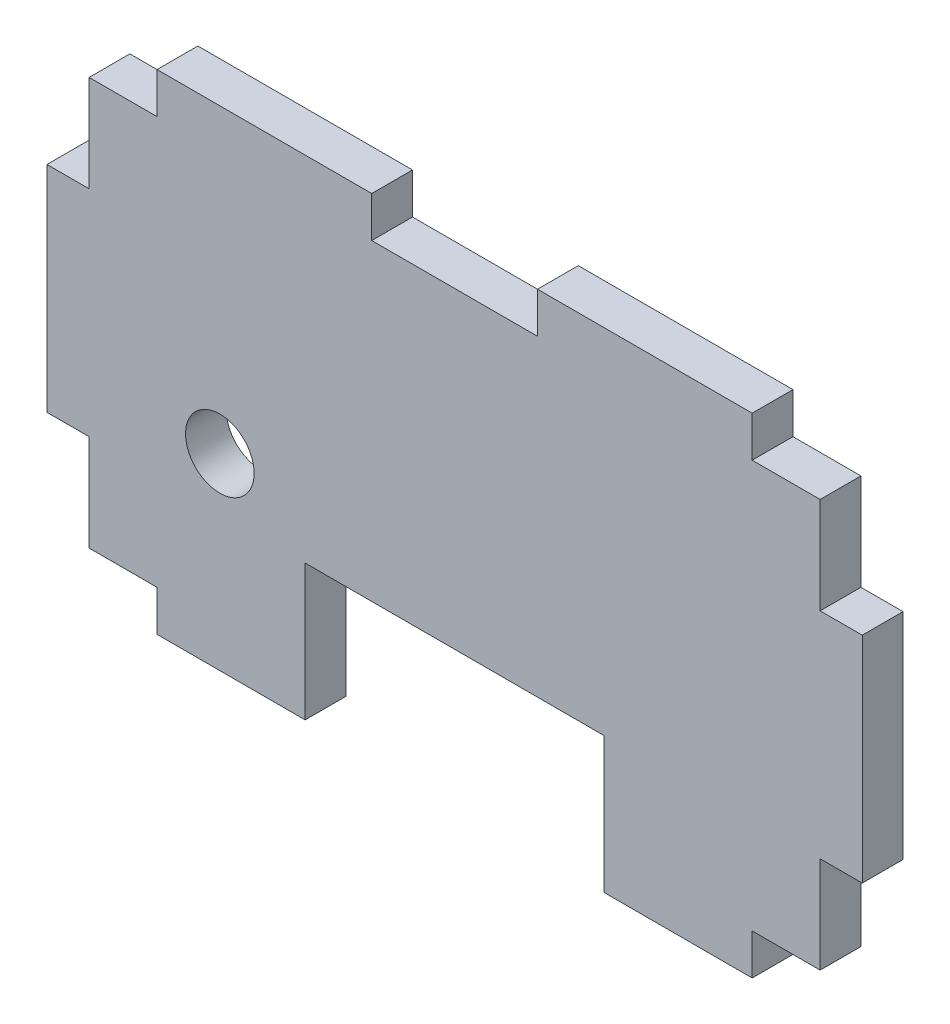
ISO-10303-21;
HEADER;
FILE_DESCRIPTION(('STEP AP214'),'2;1');
FILE_NAME('part.step','',(''),(''),'','','');
FILE_SCHEMA(('AUTOMOTIVE_DESIGN { 1 0 10303 214 1 1 1 1 }'));
ENDSEC;
DATA;
#1=APPLICATION_CONTEXT('core data for automotive mechanical design processes');
#2=APPLICATION_PROTOCOL_DEFINITION('international standard','automotive_design',2000,#1);
#3=PRODUCT_CONTEXT('',#1,'mechanical');
#4=PRODUCT('Part','Part','',(#3));
#5=PRODUCT_RELATED_PRODUCT_CATEGORY('part','',(#4));
#6=PRODUCT_DEFINITION_FORMATION('','',#4);
#7=PRODUCT_DEFINITION_CONTEXT('part definition',#1,'design');
#8=PRODUCT_DEFINITION('design','',#6,#7);
#9=PRODUCT_DEFINITION_SHAPE('','',#8);
#10=(LENGTH_UNIT() NAMED_UNIT(*) SI_UNIT(.MILLI.,.METRE.));
#11=(NAMED_UNIT(*) PLANE_ANGLE_UNIT() SI_UNIT($,.RADIAN.));
#12=(NAMED_UNIT(*) SI_UNIT($,.STERADIAN.) SOLID_ANGLE_UNIT());
#13=UNCERTAINTY_MEASURE_WITH_UNIT(LENGTH_MEASURE(1.E-05),#10,'distance_accuracy_value','');
#14=(GEOMETRIC_REPRESENTATION_CONTEXT(3) GLOBAL_UNCERTAINTY_ASSIGNED_CONTEXT((#13)) GLOBAL_UNIT_ASSIGNED_CONTEXT((#10,
#11,#12)) REPRESENTATION_CONTEXT('',''));
#15=CARTESIAN_POINT('',(0.,0.,0.));
#16=DIRECTION('',(0.,0.,1.));
#17=DIRECTION('',(1.,0.,0.));
#18=AXIS2_PLACEMENT_3D('',#15,#16,#17);
#19=CARTESIAN_POINT('',(0.,7.,3.));
#20=DIRECTION('',(0.,1.,0.));
#21=DIRECTION('',(0.,0.,1.));
#22=AXIS2_PLACEMENT_3D('',#19,#20,#21);
#23=PLANE('',#22);
#24=DIRECTION('',(1.,0.,0.));
#25=VECTOR('',#24,1.);
#26=CARTESIAN_POINT('',(0.,7.,0.));
#27=LINE('',#26,#25);
#28=CARTESIAN_POINT('',(15.9,7.,0.));
#29=VERTEX_POINT('',#28);
#30=CARTESIAN_POINT('',(37.9,7.,0.));
#31=VERTEX_POINT('',#30);
#32=EDGE_CURVE('E262',#29,#31,#27,.T.);
#33=ORIENTED_EDGE('',*,*,#32,.T.);
#34=DIRECTION('',(0.,0.,-1.));
#35=VECTOR('',#34,1.);
#36=CARTESIAN_POINT('',(37.9,7.,3.));
#37=LINE('',#36,#35);
#38=CARTESIAN_POINT('',(37.9,7.,3.));
#39=VERTEX_POINT('',#38);
#40=EDGE_CURVE('E11',#39,#31,#37,.T.);
#41=ORIENTED_EDGE('',*,*,#40,.F.);
#42=DIRECTION('',(1.,0.,0.));
#43=VECTOR('',#42,1.);
#44=CARTESIAN_POINT('',(0.,7.,3.));
#45=LINE('',#44,#43);
#46=CARTESIAN_POINT('',(15.9,7.,3.));
#47=VERTEX_POINT('',#46);
#48=EDGE_CURVE('E411',#47,#39,#45,.T.);
#49=ORIENTED_EDGE('',*,*,#48,.F.);
#50=DIRECTION('',(0.,0.,-1.));
#51=VECTOR('',#50,1.);
#52=CARTESIAN_POINT('',(15.9,7.,3.));
#53=LINE('',#52,#51);
#54=EDGE_CURVE('E56',#47,#29,#53,.T.);
#55=ORIENTED_EDGE('',*,*,#54,.T.);
#56=EDGE_LOOP('',(#33,#41,#49,#55));
#57=FACE_BOUND('',#56,.T.);
#58=ADVANCED_FACE('F39',(#57),#23,.F.);
#59=CARTESIAN_POINT('',(37.9,0.,3.));
#60=DIRECTION('',(1.,0.,0.));
#61=DIRECTION('',(0.,1.,0.));
#62=AXIS2_PLACEMENT_3D('',#59,#60,#61);
#63=PLANE('',#62);
#64=DIRECTION('',(0.,-1.,0.));
#65=VECTOR('',#64,1.);
#66=CARTESIAN_POINT('',(37.9,0.,0.));
#67=LINE('',#66,#65);
#68=CARTESIAN_POINT('',(37.9,-3.,0.));
#69=VERTEX_POINT('',#68);
#70=EDGE_CURVE('E264',#31,#69,#67,.T.);
#71=ORIENTED_EDGE('',*,*,#70,.T.);
#72=DIRECTION('',(0.,0.,-1.));
#73=VECTOR('',#72,1.);
#74=CARTESIAN_POINT('',(37.9,-3.,3.));
#75=LINE('',#74,#73);
#76=CARTESIAN_POINT('',(37.9,-3.,3.));
#77=VERTEX_POINT('',#76);
#78=EDGE_CURVE('E48',#77,#69,#75,.T.);
#79=ORIENTED_EDGE('',*,*,#78,.F.);
#80=DIRECTION('',(0.,-1.,0.));
#81=VECTOR('',#80,1.);
#82=CARTESIAN_POINT('',(37.9,0.,3.));
#83=LINE('',#82,#81);
#84=EDGE_CURVE('E155',#39,#77,#83,.T.);
#85=ORIENTED_EDGE('',*,*,#84,.F.);
#86=ORIENTED_EDGE('',*,*,#40,.T.);
#87=EDGE_LOOP('',(#71,#79,#85,#86));
#88=FACE_BOUND('',#87,.T.);
#89=ADVANCED_FACE('F395',(#88),#63,.F.);
#90=CARTESIAN_POINT('',(0.,-3.,3.));
#91=DIRECTION('',(0.,-1.,0.));
#92=DIRECTION('',(0.,0.,-1.));
#93=AXIS2_PLACEMENT_3D('',#90,#91,#92);
#94=PLANE('',#93);
#95=DIRECTION('',(-1.,0.,0.));
#96=VECTOR('',#95,1.);
#97=CARTESIAN_POINT('',(0.,-3.,0.));
#98=LINE('',#97,#96);
#99=CARTESIAN_POINT('',(48.8,-3.,0.));
#100=VERTEX_POINT('',#99);
#101=EDGE_CURVE('E267',#100,#69,#98,.T.);
#102=ORIENTED_EDGE('',*,*,#101,.F.);
#103=DIRECTION('',(0.,0.,-1.));
#104=VECTOR('',#103,1.);
#105=CARTESIAN_POINT('',(48.8,-3.,3.));
#106=LINE('',#105,#104);
#107=CARTESIAN_POINT('',(48.8,-3.,3.));
#108=VERTEX_POINT('',#107);
#109=EDGE_CURVE('E388',#108,#100,#106,.T.);
#110=ORIENTED_EDGE('',*,*,#109,.F.);
#111=DIRECTION('',(-1.,0.,0.));
#112=VECTOR('',#111,1.);
#113=CARTESIAN_POINT('',(0.,-3.,3.));
#114=LINE('',#113,#112);
#115=EDGE_CURVE('E394',#108,#77,#114,.T.);
#116=ORIENTED_EDGE('',*,*,#115,.T.);
#117=ORIENTED_EDGE('',*,*,#78,.T.);
#118=EDGE_LOOP('',(#102,#110,#116,#117));
#119=FACE_BOUND('',#118,.T.);
#120=ADVANCED_FACE('F392',(#119),#94,.T.);
#121=CARTESIAN_POINT('',(48.8,1.12872674170224E-13,3.));
#122=DIRECTION('',(1.,0.,0.));
#123=DIRECTION('',(0.,1.,0.));
#124=AXIS2_PLACEMENT_3D('',#121,#122,#123);
#125=PLANE('',#124);
#126=DIRECTION('',(0.,-1.,0.));
#127=VECTOR('',#126,1.);
#128=CARTESIAN_POINT('',(48.8,1.12872674170224E-13,0.));
#129=LINE('',#128,#127);
#130=CARTESIAN_POINT('',(48.8,0.,0.));
#131=VERTEX_POINT('',#130);
#132=EDGE_CURVE('E270',#131,#100,#129,.T.);
#133=ORIENTED_EDGE('',*,*,#132,.F.);
#134=DIRECTION('',(0.,0.,-1.));
#135=VECTOR('',#134,1.);
#136=CARTESIAN_POINT('',(48.8,0.,3.));
#137=LINE('',#136,#135);
#138=CARTESIAN_POINT('',(48.8,0.,3.));
#139=VERTEX_POINT('',#138);
#140=EDGE_CURVE('E386',#139,#131,#137,.T.);
#141=ORIENTED_EDGE('',*,*,#140,.F.);
#142=DIRECTION('',(0.,-1.,0.));
#143=VECTOR('',#142,1.);
#144=CARTESIAN_POINT('',(48.8,1.12872674170224E-13,3.));
#145=LINE('',#144,#143);
#146=EDGE_CURVE('E405',#139,#108,#145,.T.);
#147=ORIENTED_EDGE('',*,*,#146,.T.);
#148=ORIENTED_EDGE('',*,*,#109,.T.);
#149=EDGE_LOOP('',(#133,#141,#147,#148));
#150=FACE_BOUND('',#149,.T.);
#151=ADVANCED_FACE('F402',(#150),#125,.T.);
#152=CARTESIAN_POINT('',(0.,0.,3.));
#153=DIRECTION('',(0.,-1.,0.));
#154=DIRECTION('',(0.,0.,-1.));
#155=AXIS2_PLACEMENT_3D('',#152,#153,#154);
#156=PLANE('',#155);
#157=DIRECTION('',(-1.,0.,0.));
#158=VECTOR('',#157,1.);
#159=CARTESIAN_POINT('',(0.,0.,0.));
#160=LINE('',#159,#158);
#161=CARTESIAN_POINT('',(53.8,0.,0.));
#162=VERTEX_POINT('',#161);
#163=EDGE_CURVE('E273',#162,#131,#160,.T.);
#164=ORIENTED_EDGE('',*,*,#163,.F.);
#165=DIRECTION('',(0.,0.,-1.));
#166=VECTOR('',#165,1.);
#167=CARTESIAN_POINT('',(53.8,0.,3.));
#168=LINE('',#167,#166);
#169=CARTESIAN_POINT('',(53.8,0.,3.));
#170=VERTEX_POINT('',#169);
#171=EDGE_CURVE('E384',#170,#162,#168,.T.);
#172=ORIENTED_EDGE('',*,*,#171,.F.);
#173=DIRECTION('',(-1.,0.,0.));
#174=VECTOR('',#173,1.);
#175=CARTESIAN_POINT('',(0.,0.,3.));
#176=LINE('',#175,#174);
#177=EDGE_CURVE('E409',#170,#139,#176,.T.);
#178=ORIENTED_EDGE('',*,*,#177,.T.);
#179=ORIENTED_EDGE('',*,*,#140,.T.);
#180=EDGE_LOOP('',(#164,#172,#178,#179));
#181=FACE_BOUND('',#180,.T.);
#182=ADVANCED_FACE('F500',(#181),#156,.T.);
#183=CARTESIAN_POINT('',(53.8,0.,3.));
#184=DIRECTION('',(1.,0.,0.));
#185=DIRECTION('',(0.,1.,0.));
#186=AXIS2_PLACEMENT_3D('',#183,#184,#185);
#187=PLANE('',#186);
#188=DIRECTION('',(0.,-1.,0.));
#189=VECTOR('',#188,1.);
#190=CARTESIAN_POINT('',(53.8,0.,0.));
#191=LINE('',#190,#189);
#192=CARTESIAN_POINT('',(53.8,7.1,0.));
#193=VERTEX_POINT('',#192);
#194=EDGE_CURVE('E276',#193,#162,#191,.T.);
#195=ORIENTED_EDGE('',*,*,#194,.F.);
#196=DIRECTION('',(0.,0.,-1.));
#197=VECTOR('',#196,1.);
#198=CARTESIAN_POINT('',(53.8,7.1,3.));
#199=LINE('',#198,#197);
#200=CARTESIAN_POINT('',(53.8,7.1,3.));
#201=VERTEX_POINT('',#200);
#202=EDGE_CURVE('E382',#201,#193,#199,.T.);
#203=ORIENTED_EDGE('',*,*,#202,.F.);
#204=DIRECTION('',(0.,-1.,0.));
#205=VECTOR('',#204,1.);
#206=CARTESIAN_POINT('',(53.8,0.,3.));
#207=LINE('',#206,#205);
#208=EDGE_CURVE('E416',#201,#170,#207,.T.);
#209=ORIENTED_EDGE('',*,*,#208,.T.);
#210=ORIENTED_EDGE('',*,*,#171,.T.);
#211=EDGE_LOOP('',(#195,#203,#209,#210));
#212=FACE_BOUND('',#211,.T.);
#213=ADVANCED_FACE('F503',(#212),#187,.T.);
#214=CARTESIAN_POINT('',(0.,7.1,3.));
#215=DIRECTION('',(0.,-1.,0.));
#216=DIRECTION('',(0.,0.,-1.));
#217=AXIS2_PLACEMENT_3D('',#214,#215,#216);
#218=PLANE('',#217);
#219=DIRECTION('',(-1.,0.,0.));
#220=VECTOR('',#219,1.);
#221=CARTESIAN_POINT('',(0.,7.1,0.));
#222=LINE('',#221,#220);
#223=CARTESIAN_POINT('',(56.9,7.1,0.));
#224=VERTEX_POINT('',#223);
#225=EDGE_CURVE('E279',#224,#193,#222,.T.);
#226=ORIENTED_EDGE('',*,*,#225,.F.);
#227=DIRECTION('',(0.,0.,-1.));
#228=VECTOR('',#227,1.);
#229=CARTESIAN_POINT('',(56.9,7.1,3.));
#230=LINE('',#229,#228);
#231=CARTESIAN_POINT('',(56.9,7.1,3.));
#232=VERTEX_POINT('',#231);
#233=EDGE_CURVE('E380',#232,#224,#230,.T.);
#234=ORIENTED_EDGE('',*,*,#233,.F.);
#235=DIRECTION('',(-1.,0.,0.));
#236=VECTOR('',#235,1.);
#237=CARTESIAN_POINT('',(0.,7.1,3.));
#238=LINE('',#237,#236);
#239=EDGE_CURVE('E419',#232,#201,#238,.T.);
#240=ORIENTED_EDGE('',*,*,#239,.T.);
#241=ORIENTED_EDGE('',*,*,#202,.T.);
#242=EDGE_LOOP('',(#226,#234,#240,#241));
#243=FACE_BOUND('',#242,.T.);
#244=ADVANCED_FACE('F507',(#243),#218,.T.);
#245=CARTESIAN_POINT('',(56.9,0.,3.));
#246=DIRECTION('',(-1.,0.,0.));
#247=DIRECTION('',(0.,0.,1.));
#248=AXIS2_PLACEMENT_3D('',#245,#246,#247);
#249=PLANE('',#248);
#250=DIRECTION('',(0.,1.,0.));
#251=VECTOR('',#250,1.);
#252=CARTESIAN_POINT('',(56.9,0.,0.));
#253=LINE('',#252,#251);
#254=CARTESIAN_POINT('',(56.9,22.9,0.));
#255=VERTEX_POINT('',#254);
#256=EDGE_CURVE('E282',#224,#255,#253,.T.);
#257=ORIENTED_EDGE('',*,*,#256,.T.);
#258=DIRECTION('',(0.,0.,-1.));
#259=VECTOR('',#258,1.);
#260=CARTESIAN_POINT('',(56.9,22.9,3.));
#261=LINE('',#260,#259);
#262=CARTESIAN_POINT('',(56.9,22.9,3.));
#263=VERTEX_POINT('',#262);
#264=EDGE_CURVE('E378',#263,#255,#261,.T.);
#265=ORIENTED_EDGE('',*,*,#264,.F.);
#266=DIRECTION('',(0.,1.,0.));
#267=VECTOR('',#266,1.);
#268=CARTESIAN_POINT('',(56.9,0.,3.));
#269=LINE('',#268,#267);
#270=EDGE_CURVE('E422',#232,#263,#269,.T.);
#271=ORIENTED_EDGE('',*,*,#270,.F.);
#272=ORIENTED_EDGE('',*,*,#233,.T.);
#273=EDGE_LOOP('',(#257,#265,#271,#272));
#274=FACE_BOUND('',#273,.T.);
#275=ADVANCED_FACE('F511',(#274),#249,.F.);
#276=CARTESIAN_POINT('',(0.,22.9,3.));
#277=DIRECTION('',(0.,1.,0.));
#278=DIRECTION('',(0.,0.,1.));
#279=AXIS2_PLACEMENT_3D('',#276,#277,#278);
#280=PLANE('',#279);
#281=DIRECTION('',(1.,0.,0.));
#282=VECTOR('',#281,1.);
#283=CARTESIAN_POINT('',(0.,22.9,0.));
#284=LINE('',#283,#282);
#285=CARTESIAN_POINT('',(53.8,22.9,0.));
#286=VERTEX_POINT('',#285);
#287=EDGE_CURVE('E285',#286,#255,#284,.T.);
#288=ORIENTED_EDGE('',*,*,#287,.F.);
#289=DIRECTION('',(0.,0.,-1.));
#290=VECTOR('',#289,1.);
#291=CARTESIAN_POINT('',(53.8,22.9,3.));
#292=LINE('',#291,#290);
#293=CARTESIAN_POINT('',(53.8,22.9,3.));
#294=VERTEX_POINT('',#293);
#295=EDGE_CURVE('E376',#294,#286,#292,.T.);
#296=ORIENTED_EDGE('',*,*,#295,.F.);
#297=DIRECTION('',(1.,0.,0.));
#298=VECTOR('',#297,1.);
#299=CARTESIAN_POINT('',(0.,22.9,3.));
#300=LINE('',#299,#298);
#301=EDGE_CURVE('E424',#294,#263,#300,.T.);
#302=ORIENTED_EDGE('',*,*,#301,.T.);
#303=ORIENTED_EDGE('',*,*,#264,.T.);
#304=EDGE_LOOP('',(#288,#296,#302,#303));
#305=FACE_BOUND('',#304,.T.);
#306=ADVANCED_FACE('F515',(#305),#280,.T.);
#307=CARTESIAN_POINT('',(53.8,0.,3.));
#308=DIRECTION('',(1.,0.,0.));
#309=DIRECTION('',(0.,0.,-1.));
#310=AXIS2_PLACEMENT_3D('',#307,#308,#309);
#311=PLANE('',#310);
#312=DIRECTION('',(0.,-1.,0.));
#313=VECTOR('',#312,1.);
#314=CARTESIAN_POINT('',(53.8,0.,0.));
#315=LINE('',#314,#313);
#316=CARTESIAN_POINT('',(53.8,30.,0.));
#317=VERTEX_POINT('',#316);
#318=EDGE_CURVE('E288',#317,#286,#315,.T.);
#319=ORIENTED_EDGE('',*,*,#318,.F.);
#320=DIRECTION('',(0.,0.,-1.));
#321=VECTOR('',#320,1.);
#322=CARTESIAN_POINT('',(53.8,30.,3.));
#323=LINE('',#322,#321);
#324=CARTESIAN_POINT('',(53.8,30.,3.));
#325=VERTEX_POINT('',#324);
#326=EDGE_CURVE('E374',#325,#317,#323,.T.);
#327=ORIENTED_EDGE('',*,*,#326,.F.);
#328=DIRECTION('',(0.,-1.,0.));
#329=VECTOR('',#328,1.);
#330=CARTESIAN_POINT('',(53.8,0.,3.));
#331=LINE('',#330,#329);
#332=EDGE_CURVE('E427',#325,#294,#331,.T.);
#333=ORIENTED_EDGE('',*,*,#332,.T.);
#334=ORIENTED_EDGE('',*,*,#295,.T.);
#335=EDGE_LOOP('',(#319,#327,#333,#334));
#336=FACE_BOUND('',#335,.T.);
#337=ADVANCED_FACE('F519',(#336),#311,.T.);
#338=CARTESIAN_POINT('',(0.,30.,3.));
#339=DIRECTION('',(0.,1.,0.));
#340=DIRECTION('',(0.,0.,1.));
#341=AXIS2_PLACEMENT_3D('',#338,#339,#340);
#342=PLANE('',#341);
#343=DIRECTION('',(1.,0.,0.));
#344=VECTOR('',#343,1.);
#345=CARTESIAN_POINT('',(0.,30.,0.));
#346=LINE('',#345,#344);
#347=CARTESIAN_POINT('',(48.8,30.,0.));
#348=VERTEX_POINT('',#347);
#349=EDGE_CURVE('E291',#348,#317,#346,.T.);
#350=ORIENTED_EDGE('',*,*,#349,.F.);
#351=DIRECTION('',(0.,0.,-1.));
#352=VECTOR('',#351,1.);
#353=CARTESIAN_POINT('',(48.8,30.,3.));
#354=LINE('',#353,#352);
#355=CARTESIAN_POINT('',(48.8,30.,3.));
#356=VERTEX_POINT('',#355);
#357=EDGE_CURVE('E372',#356,#348,#354,.T.);
#358=ORIENTED_EDGE('',*,*,#357,.F.);
#359=DIRECTION('',(1.,0.,0.));
#360=VECTOR('',#359,1.);
#361=CARTESIAN_POINT('',(0.,30.,3.));
#362=LINE('',#361,#360);
#363=EDGE_CURVE('E430',#356,#325,#362,.T.);
#364=ORIENTED_EDGE('',*,*,#363,.T.);
#365=ORIENTED_EDGE('',*,*,#326,.T.);
#366=EDGE_LOOP('',(#350,#358,#364,#365));
#367=FACE_BOUND('',#366,.T.);
#368=ADVANCED_FACE('F523',(#367),#342,.T.);
#369=CARTESIAN_POINT('',(48.8,0.,3.));
#370=DIRECTION('',(1.,0.,0.));
#371=DIRECTION('',(0.,0.,-1.));
#372=AXIS2_PLACEMENT_3D('',#369,#370,#371);
#373=PLANE('',#372);
#374=DIRECTION('',(0.,-1.,0.));
#375=VECTOR('',#374,1.);
#376=CARTESIAN_POINT('',(48.8,0.,0.));
#377=LINE('',#376,#375);
#378=CARTESIAN_POINT('',(48.8,33.,0.));
#379=VERTEX_POINT('',#378);
#380=EDGE_CURVE('E294',#379,#348,#377,.T.);
#381=ORIENTED_EDGE('',*,*,#380,.F.);
#382=DIRECTION('',(0.,0.,-1.));
#383=VECTOR('',#382,1.);
#384=CARTESIAN_POINT('',(48.8,33.,3.));
#385=LINE('',#384,#383);
#386=CARTESIAN_POINT('',(48.8,33.,3.));
#387=VERTEX_POINT('',#386);
#388=EDGE_CURVE('E370',#387,#379,#385,.T.);
#389=ORIENTED_EDGE('',*,*,#388,.F.);
#390=DIRECTION('',(0.,-1.,0.));
#391=VECTOR('',#390,1.);
#392=CARTESIAN_POINT('',(48.8,0.,3.));
#393=LINE('',#392,#391);
#394=EDGE_CURVE('E433',#387,#356,#393,.T.);
#395=ORIENTED_EDGE('',*,*,#394,.T.);
#396=ORIENTED_EDGE('',*,*,#357,.T.);
#397=EDGE_LOOP('',(#381,#389,#395,#396));
#398=FACE_BOUND('',#397,.T.);
#399=ADVANCED_FACE('F527',(#398),#373,.T.);
#400=CARTESIAN_POINT('',(0.,33.,3.));
#401=DIRECTION('',(0.,1.,0.));
#402=DIRECTION('',(0.,0.,1.));
#403=AXIS2_PLACEMENT_3D('',#400,#401,#402);
#404=PLANE('',#403);
#405=DIRECTION('',(1.,0.,0.));
#406=VECTOR('',#405,1.);
#407=CARTESIAN_POINT('',(0.,33.,0.));
#408=LINE('',#407,#406);
#409=CARTESIAN_POINT('',(33.,33.,0.));
#410=VERTEX_POINT('',#409);
#411=EDGE_CURVE('E297',#410,#379,#408,.T.);
#412=ORIENTED_EDGE('',*,*,#411,.F.);
#413=DIRECTION('',(0.,0.,-1.));
#414=VECTOR('',#413,1.);
#415=CARTESIAN_POINT('',(33.,33.,3.));
#416=LINE('',#415,#414);
#417=CARTESIAN_POINT('',(33.,33.,3.));
#418=VERTEX_POINT('',#417);
#419=EDGE_CURVE('E368',#418,#410,#416,.T.);
#420=ORIENTED_EDGE('',*,*,#419,.F.);
#421=DIRECTION('',(1.,0.,0.));
#422=VECTOR('',#421,1.);
#423=CARTESIAN_POINT('',(0.,33.,3.));
#424=LINE('',#423,#422);
#425=EDGE_CURVE('E436',#418,#387,#424,.T.);
#426=ORIENTED_EDGE('',*,*,#425,.T.);
#427=ORIENTED_EDGE('',*,*,#388,.T.);
#428=EDGE_LOOP('',(#412,#420,#426,#427));
#429=FACE_BOUND('',#428,.T.);
#430=ADVANCED_FACE('F531',(#429),#404,.T.);
#431=CARTESIAN_POINT('',(33.,0.,3.));
#432=DIRECTION('',(-1.,0.,0.));
#433=DIRECTION('',(0.,0.,1.));
#434=AXIS2_PLACEMENT_3D('',#431,#432,#433);
#435=PLANE('',#434);
#436=DIRECTION('',(0.,1.,0.));
#437=VECTOR('',#436,1.);
#438=CARTESIAN_POINT('',(33.,0.,0.));
#439=LINE('',#438,#437);
#440=CARTESIAN_POINT('',(33.,30.,0.));
#441=VERTEX_POINT('',#440);
#442=EDGE_CURVE('E300',#441,#410,#439,.T.);
#443=ORIENTED_EDGE('',*,*,#442,.F.);
#444=DIRECTION('',(0.,0.,-1.));
#445=VECTOR('',#444,1.);
#446=CARTESIAN_POINT('',(33.,30.,3.));
#447=LINE('',#446,#445);
#448=CARTESIAN_POINT('',(33.,30.,3.));
#449=VERTEX_POINT('',#448);
#450=EDGE_CURVE('E366',#449,#441,#447,.T.);
#451=ORIENTED_EDGE('',*,*,#450,.F.);
#452=DIRECTION('',(0.,1.,0.));
#453=VECTOR('',#452,1.);
#454=CARTESIAN_POINT('',(33.,0.,3.));
#455=LINE('',#454,#453);
#456=EDGE_CURVE('E439',#449,#418,#455,.T.);
#457=ORIENTED_EDGE('',*,*,#456,.T.);
#458=ORIENTED_EDGE('',*,*,#419,.T.);
#459=EDGE_LOOP('',(#443,#451,#457,#458));
#460=FACE_BOUND('',#459,.T.);
#461=ADVANCED_FACE('F535',(#460),#435,.T.);
#462=CARTESIAN_POINT('',(0.,30.,3.));
#463=DIRECTION('',(0.,1.,0.));
#464=DIRECTION('',(0.,0.,1.));
#465=AXIS2_PLACEMENT_3D('',#462,#463,#464);
#466=PLANE('',#465);
#467=DIRECTION('',(1.,0.,0.));
#468=VECTOR('',#467,1.);
#469=CARTESIAN_POINT('',(0.,30.,0.));
#470=LINE('',#469,#468);
#471=CARTESIAN_POINT('',(20.8,30.,0.));
#472=VERTEX_POINT('',#471);
#473=EDGE_CURVE('E303',#472,#441,#470,.T.);
#474=ORIENTED_EDGE('',*,*,#473,.F.);
#475=DIRECTION('',(0.,0.,-1.));
#476=VECTOR('',#475,1.);
#477=CARTESIAN_POINT('',(20.8,30.,3.));
#478=LINE('',#477,#476);
#479=CARTESIAN_POINT('',(20.8,30.,3.));
#480=VERTEX_POINT('',#479);
#481=EDGE_CURVE('E364',#480,#472,#478,.T.);
#482=ORIENTED_EDGE('',*,*,#481,.F.);
#483=DIRECTION('',(1.,0.,0.));
#484=VECTOR('',#483,1.);
#485=CARTESIAN_POINT('',(0.,30.,3.));
#486=LINE('',#485,#484);
#487=EDGE_CURVE('E442',#480,#449,#486,.T.);
#488=ORIENTED_EDGE('',*,*,#487,.T.);
#489=ORIENTED_EDGE('',*,*,#450,.T.);
#490=EDGE_LOOP('',(#474,#482,#488,#489));
#491=FACE_BOUND('',#490,.T.);
#492=ADVANCED_FACE('F539',(#491),#466,.T.);
#493=CARTESIAN_POINT('',(20.8,0.,3.));
#494=DIRECTION('',(1.,0.,0.));
#495=DIRECTION('',(0.,0.,-1.));
#496=AXIS2_PLACEMENT_3D('',#493,#494,#495);
#497=PLANE('',#496);
#498=DIRECTION('',(0.,-1.,0.));
#499=VECTOR('',#498,1.);
#500=CARTESIAN_POINT('',(20.8,0.,0.));
#501=LINE('',#500,#499);
#502=CARTESIAN_POINT('',(20.8,33.,0.));
#503=VERTEX_POINT('',#502);
#504=EDGE_CURVE('E306',#503,#472,#501,.T.);
#505=ORIENTED_EDGE('',*,*,#504,.F.);
#506=DIRECTION('',(0.,0.,-1.));
#507=VECTOR('',#506,1.);
#508=CARTESIAN_POINT('',(20.8,33.,3.));
#509=LINE('',#508,#507);
#510=CARTESIAN_POINT('',(20.8,33.,3.));
#511=VERTEX_POINT('',#510);
#512=EDGE_CURVE('E362',#511,#503,#509,.T.);
#513=ORIENTED_EDGE('',*,*,#512,.F.);
#514=DIRECTION('',(0.,-1.,0.));
#515=VECTOR('',#514,1.);
#516=CARTESIAN_POINT('',(20.8,0.,3.));
#517=LINE('',#516,#515);
#518=EDGE_CURVE('E445',#511,#480,#517,.T.);
#519=ORIENTED_EDGE('',*,*,#518,.T.);
#520=ORIENTED_EDGE('',*,*,#481,.T.);
#521=EDGE_LOOP('',(#505,#513,#519,#520));
#522=FACE_BOUND('',#521,.T.);
#523=ADVANCED_FACE('F543',(#522),#497,.T.);
#524=CARTESIAN_POINT('',(0.,33.,3.));
#525=DIRECTION('',(0.,1.,0.));
#526=DIRECTION('',(0.,0.,1.));
#527=AXIS2_PLACEMENT_3D('',#524,#525,#526);
#528=PLANE('',#527);
#529=DIRECTION('',(1.,0.,0.));
#530=VECTOR('',#529,1.);
#531=CARTESIAN_POINT('',(0.,33.,0.));
#532=LINE('',#531,#530);
#533=CARTESIAN_POINT('',(5.,33.,0.));
#534=VERTEX_POINT('',#533);
#535=EDGE_CURVE('E309',#534,#503,#532,.T.);
#536=ORIENTED_EDGE('',*,*,#535,.F.);
#537=DIRECTION('',(0.,0.,-1.));
#538=VECTOR('',#537,1.);
#539=CARTESIAN_POINT('',(5.,33.,3.));
#540=LINE('',#539,#538);
#541=CARTESIAN_POINT('',(5.,33.,3.));
#542=VERTEX_POINT('',#541);
#543=EDGE_CURVE('E360',#542,#534,#540,.T.);
#544=ORIENTED_EDGE('',*,*,#543,.F.);
#545=DIRECTION('',(1.,0.,0.));
#546=VECTOR('',#545,1.);
#547=CARTESIAN_POINT('',(0.,33.,3.));
#548=LINE('',#547,#546);
#549=EDGE_CURVE('E448',#542,#511,#548,.T.);
#550=ORIENTED_EDGE('',*,*,#549,.T.);
#551=ORIENTED_EDGE('',*,*,#512,.T.);
#552=EDGE_LOOP('',(#536,#544,#550,#551));
#553=FACE_BOUND('',#552,.T.);
#554=ADVANCED_FACE('F547',(#553),#528,.T.);
#555=CARTESIAN_POINT('',(5.,0.,3.));
#556=DIRECTION('',(-1.,0.,0.));
#557=DIRECTION('',(0.,0.,1.));
#558=AXIS2_PLACEMENT_3D('',#555,#556,#557);
#559=PLANE('',#558);
#560=DIRECTION('',(0.,1.,0.));
#561=VECTOR('',#560,1.);
#562=CARTESIAN_POINT('',(5.,0.,0.));
#563=LINE('',#562,#561);
#564=CARTESIAN_POINT('',(5.,30.,0.));
#565=VERTEX_POINT('',#564);
#566=EDGE_CURVE('E312',#565,#534,#563,.T.);
#567=ORIENTED_EDGE('',*,*,#566,.F.);
#568=DIRECTION('',(0.,0.,-1.));
#569=VECTOR('',#568,1.);
#570=CARTESIAN_POINT('',(5.,30.,3.));
#571=LINE('',#570,#569);
#572=CARTESIAN_POINT('',(5.,30.,3.));
#573=VERTEX_POINT('',#572);
#574=EDGE_CURVE('E358',#573,#565,#571,.T.);
#575=ORIENTED_EDGE('',*,*,#574,.F.);
#576=DIRECTION('',(0.,1.,0.));
#577=VECTOR('',#576,1.);
#578=CARTESIAN_POINT('',(5.,0.,3.));
#579=LINE('',#578,#577);
#580=EDGE_CURVE('E451',#573,#542,#579,.T.);
#581=ORIENTED_EDGE('',*,*,#580,.T.);
#582=ORIENTED_EDGE('',*,*,#543,.T.);
#583=EDGE_LOOP('',(#567,#575,#581,#582));
#584=FACE_BOUND('',#583,.T.);
#585=ADVANCED_FACE('F551',(#584),#559,.T.);
#586=CARTESIAN_POINT('',(0.,30.,3.));
#587=DIRECTION('',(0.,1.,0.));
#588=DIRECTION('',(0.,0.,1.));
#589=AXIS2_PLACEMENT_3D('',#586,#587,#588);
#590=PLANE('',#589);
#591=DIRECTION('',(1.,0.,0.));
#592=VECTOR('',#591,1.);
#593=CARTESIAN_POINT('',(0.,30.,0.));
#594=LINE('',#593,#592);
#595=CARTESIAN_POINT('',(0.,30.,0.));
#596=VERTEX_POINT('',#595);
#597=EDGE_CURVE('E315',#596,#565,#594,.T.);
#598=ORIENTED_EDGE('',*,*,#597,.F.);
#599=DIRECTION('',(0.,0.,-1.));
#600=VECTOR('',#599,1.);
#601=CARTESIAN_POINT('',(0.,30.,3.));
#602=LINE('',#601,#600);
#603=CARTESIAN_POINT('',(0.,30.,3.));
#604=VERTEX_POINT('',#603);
#605=EDGE_CURVE('E356',#604,#596,#602,.T.);
#606=ORIENTED_EDGE('',*,*,#605,.F.);
#607=DIRECTION('',(1.,0.,0.));
#608=VECTOR('',#607,1.);
#609=CARTESIAN_POINT('',(0.,30.,3.));
#610=LINE('',#609,#608);
#611=EDGE_CURVE('E454',#604,#573,#610,.T.);
#612=ORIENTED_EDGE('',*,*,#611,.T.);
#613=ORIENTED_EDGE('',*,*,#574,.T.);
#614=EDGE_LOOP('',(#598,#606,#612,#613));
#615=FACE_BOUND('',#614,.T.);
#616=ADVANCED_FACE('F555',(#615),#590,.T.);
#617=CARTESIAN_POINT('',(0.,0.,3.));
#618=DIRECTION('',(-1.,0.,0.));
#619=DIRECTION('',(0.,0.,1.));
#620=AXIS2_PLACEMENT_3D('',#617,#618,#619);
#621=PLANE('',#620);
#622=DIRECTION('',(0.,1.,0.));
#623=VECTOR('',#622,1.);
#624=CARTESIAN_POINT('',(0.,0.,0.));
#625=LINE('',#624,#623);
#626=CARTESIAN_POINT('',(0.,22.9,0.));
#627=VERTEX_POINT('',#626);
#628=EDGE_CURVE('E318',#627,#596,#625,.T.);
#629=ORIENTED_EDGE('',*,*,#628,.F.);
#630=DIRECTION('',(0.,0.,-1.));
#631=VECTOR('',#630,1.);
#632=CARTESIAN_POINT('',(0.,22.9,3.));
#633=LINE('',#632,#631);
#634=CARTESIAN_POINT('',(0.,22.9,3.));
#635=VERTEX_POINT('',#634);
#636=EDGE_CURVE('E354',#635,#627,#633,.T.);
#637=ORIENTED_EDGE('',*,*,#636,.F.);
#638=DIRECTION('',(0.,1.,0.));
#639=VECTOR('',#638,1.);
#640=CARTESIAN_POINT('',(0.,0.,3.));
#641=LINE('',#640,#639);
#642=EDGE_CURVE('E457',#635,#604,#641,.T.);
#643=ORIENTED_EDGE('',*,*,#642,.T.);
#644=ORIENTED_EDGE('',*,*,#605,.T.);
#645=EDGE_LOOP('',(#629,#637,#643,#644));
#646=FACE_BOUND('',#645,.T.);
#647=ADVANCED_FACE('F559',(#646),#621,.T.);
#648=CARTESIAN_POINT('',(0.,22.9,3.));
#649=DIRECTION('',(0.,1.,0.));
#650=DIRECTION('',(0.,0.,1.));
#651=AXIS2_PLACEMENT_3D('',#648,#649,#650);
#652=PLANE('',#651);
#653=DIRECTION('',(1.,0.,0.));
#654=VECTOR('',#653,1.);
#655=CARTESIAN_POINT('',(0.,22.9,0.));
#656=LINE('',#655,#654);
#657=CARTESIAN_POINT('',(-3.1,22.9,0.));
#658=VERTEX_POINT('',#657);
#659=EDGE_CURVE('E321',#658,#627,#656,.T.);
#660=ORIENTED_EDGE('',*,*,#659,.F.);
#661=DIRECTION('',(0.,0.,-1.));
#662=VECTOR('',#661,1.);
#663=CARTESIAN_POINT('',(-3.1,22.9,3.));
#664=LINE('',#663,#662);
#665=CARTESIAN_POINT('',(-3.1,22.9,3.));
#666=VERTEX_POINT('',#665);
#667=EDGE_CURVE('E352',#666,#658,#664,.T.);
#668=ORIENTED_EDGE('',*,*,#667,.F.);
#669=DIRECTION('',(1.,0.,0.));
#670=VECTOR('',#669,1.);
#671=CARTESIAN_POINT('',(0.,22.9,3.));
#672=LINE('',#671,#670);
#673=EDGE_CURVE('E460',#666,#635,#672,.T.);
#674=ORIENTED_EDGE('',*,*,#673,.T.);
#675=ORIENTED_EDGE('',*,*,#636,.T.);
#676=EDGE_LOOP('',(#660,#668,#674,#675));
#677=FACE_BOUND('',#676,.T.);
#678=ADVANCED_FACE('F563',(#677),#652,.T.);
#679=CARTESIAN_POINT('',(-3.1,0.,3.));
#680=DIRECTION('',(-1.,0.,0.));
#681=DIRECTION('',(0.,0.,1.));
#682=AXIS2_PLACEMENT_3D('',#679,#680,#681);
#683=PLANE('',#682);
#684=DIRECTION('',(0.,1.,0.));
#685=VECTOR('',#684,1.);
#686=CARTESIAN_POINT('',(-3.1,0.,0.));
#687=LINE('',#686,#685);
#688=CARTESIAN_POINT('',(-3.1,7.1,0.));
#689=VERTEX_POINT('',#688);
#690=EDGE_CURVE('E324',#689,#658,#687,.T.);
#691=ORIENTED_EDGE('',*,*,#690,.F.);
#692=DIRECTION('',(0.,0.,-1.));
#693=VECTOR('',#692,1.);
#694=CARTESIAN_POINT('',(-3.1,7.1,3.));
#695=LINE('',#694,#693);
#696=CARTESIAN_POINT('',(-3.1,7.1,3.));
#697=VERTEX_POINT('',#696);
#698=EDGE_CURVE('E350',#697,#689,#695,.T.);
#699=ORIENTED_EDGE('',*,*,#698,.F.);
#700=DIRECTION('',(0.,1.,0.));
#701=VECTOR('',#700,1.);
#702=CARTESIAN_POINT('',(-3.1,0.,3.));
#703=LINE('',#702,#701);
#704=EDGE_CURVE('E463',#697,#666,#703,.T.);
#705=ORIENTED_EDGE('',*,*,#704,.T.);
#706=ORIENTED_EDGE('',*,*,#667,.T.);
#707=EDGE_LOOP('',(#691,#699,#705,#706));
#708=FACE_BOUND('',#707,.T.);
#709=ADVANCED_FACE('F567',(#708),#683,.T.);
#710=CARTESIAN_POINT('',(0.,7.1,3.));
#711=DIRECTION('',(0.,-1.,0.));
#712=DIRECTION('',(0.,0.,-1.));
#713=AXIS2_PLACEMENT_3D('',#710,#711,#712);
#714=PLANE('',#713);
#715=DIRECTION('',(-1.,0.,0.));
#716=VECTOR('',#715,1.);
#717=CARTESIAN_POINT('',(0.,7.1,0.));
#718=LINE('',#717,#716);
#719=CARTESIAN_POINT('',(0.,7.1,0.));
#720=VERTEX_POINT('',#719);
#721=EDGE_CURVE('E327',#720,#689,#718,.T.);
#722=ORIENTED_EDGE('',*,*,#721,.F.);
#723=DIRECTION('',(0.,0.,-1.));
#724=VECTOR('',#723,1.);
#725=CARTESIAN_POINT('',(0.,7.1,3.));
#726=LINE('',#725,#724);
#727=CARTESIAN_POINT('',(0.,7.1,3.));
#728=VERTEX_POINT('',#727);
#729=EDGE_CURVE('E348',#728,#720,#726,.T.);
#730=ORIENTED_EDGE('',*,*,#729,.F.);
#731=DIRECTION('',(-1.,0.,0.));
#732=VECTOR('',#731,1.);
#733=CARTESIAN_POINT('',(0.,7.1,3.));
#734=LINE('',#733,#732);
#735=EDGE_CURVE('E466',#728,#697,#734,.T.);
#736=ORIENTED_EDGE('',*,*,#735,.T.);
#737=ORIENTED_EDGE('',*,*,#698,.T.);
#738=EDGE_LOOP('',(#722,#730,#736,#737));
#739=FACE_BOUND('',#738,.T.);
#740=ADVANCED_FACE('F571',(#739),#714,.T.);
#741=CARTESIAN_POINT('',(0.,0.,3.));
#742=DIRECTION('',(-1.,0.,0.));
#743=DIRECTION('',(0.,0.,1.));
#744=AXIS2_PLACEMENT_3D('',#741,#742,#743);
#745=PLANE('',#744);
#746=DIRECTION('',(0.,1.,0.));
#747=VECTOR('',#746,1.);
#748=CARTESIAN_POINT('',(0.,0.,0.));
#749=LINE('',#748,#747);
#750=CARTESIAN_POINT('',(0.,0.,0.));
#751=VERTEX_POINT('',#750);
#752=EDGE_CURVE('E330',#751,#720,#749,.T.);
#753=ORIENTED_EDGE('',*,*,#752,.F.);
#754=DIRECTION('',(0.,0.,-1.));
#755=VECTOR('',#754,1.);
#756=CARTESIAN_POINT('',(0.,0.,3.));
#757=LINE('',#756,#755);
#758=CARTESIAN_POINT('',(0.,0.,3.));
#759=VERTEX_POINT('',#758);
#760=EDGE_CURVE('E346',#759,#751,#757,.T.);
#761=ORIENTED_EDGE('',*,*,#760,.F.);
#762=DIRECTION('',(0.,1.,0.));
#763=VECTOR('',#762,1.);
#764=CARTESIAN_POINT('',(0.,0.,3.));
#765=LINE('',#764,#763);
#766=EDGE_CURVE('E254',#759,#728,#765,.T.);
#767=ORIENTED_EDGE('',*,*,#766,.T.);
#768=ORIENTED_EDGE('',*,*,#729,.T.);
#769=EDGE_LOOP('',(#753,#761,#767,#768));
#770=FACE_BOUND('',#769,.T.);
#771=ADVANCED_FACE('F471',(#770),#745,.T.);
#772=CARTESIAN_POINT('',(0.,0.,3.));
#773=DIRECTION('',(0.,-1.,0.));
#774=DIRECTION('',(0.,0.,-1.));
#775=AXIS2_PLACEMENT_3D('',#772,#773,#774);
#776=PLANE('',#775);
#777=DIRECTION('',(-1.,0.,0.));
#778=VECTOR('',#777,1.);
#779=CARTESIAN_POINT('',(0.,0.,0.));
#780=LINE('',#779,#778);
#781=CARTESIAN_POINT('',(5.,0.,0.));
#782=VERTEX_POINT('',#781);
#783=EDGE_CURVE('E333',#782,#751,#780,.T.);
#784=ORIENTED_EDGE('',*,*,#783,.F.);
#785=DIRECTION('',(0.,0.,-1.));
#786=VECTOR('',#785,1.);
#787=CARTESIAN_POINT('',(5.,0.,3.));
#788=LINE('',#787,#786);
#789=CARTESIAN_POINT('',(5.,0.,3.));
#790=VERTEX_POINT('',#789);
#791=EDGE_CURVE('E240',#790,#782,#788,.T.);
#792=ORIENTED_EDGE('',*,*,#791,.F.);
#793=DIRECTION('',(-1.,0.,0.));
#794=VECTOR('',#793,1.);
#795=CARTESIAN_POINT('',(0.,0.,3.));
#796=LINE('',#795,#794);
#797=EDGE_CURVE('E252',#790,#759,#796,.T.);
#798=ORIENTED_EDGE('',*,*,#797,.T.);
#799=ORIENTED_EDGE('',*,*,#760,.T.);
#800=EDGE_LOOP('',(#784,#792,#798,#799));
#801=FACE_BOUND('',#800,.T.);
#802=ADVANCED_FACE('F477',(#801),#776,.T.);
#803=CARTESIAN_POINT('',(5.,0.,3.));
#804=DIRECTION('',(-1.,0.,0.));
#805=DIRECTION('',(0.,-1.,0.));
#806=AXIS2_PLACEMENT_3D('',#803,#804,#805);
#807=PLANE('',#806);
#808=DIRECTION('',(0.,1.,0.));
#809=VECTOR('',#808,1.);
#810=CARTESIAN_POINT('',(5.,0.,0.));
#811=LINE('',#810,#809);
#812=CARTESIAN_POINT('',(5.,-3.,0.));
#813=VERTEX_POINT('',#812);
#814=EDGE_CURVE('E237',#813,#782,#811,.T.);
#815=ORIENTED_EDGE('',*,*,#814,.F.);
#816=DIRECTION('',(0.,0.,-1.));
#817=VECTOR('',#816,1.);
#818=CARTESIAN_POINT('',(5.,-3.,3.));
#819=LINE('',#818,#817);
#820=CARTESIAN_POINT('',(5.,-3.,3.));
#821=VERTEX_POINT('',#820);
#822=EDGE_CURVE('E231',#821,#813,#819,.T.);
#823=ORIENTED_EDGE('',*,*,#822,.F.);
#824=DIRECTION('',(0.,1.,0.));
#825=VECTOR('',#824,1.);
#826=CARTESIAN_POINT('',(5.,0.,3.));
#827=LINE('',#826,#825);
#828=EDGE_CURVE('E235',#821,#790,#827,.T.);
#829=ORIENTED_EDGE('',*,*,#828,.T.);
#830=ORIENTED_EDGE('',*,*,#791,.T.);
#831=EDGE_LOOP('',(#815,#823,#829,#830));
#832=FACE_BOUND('',#831,.T.);
#833=ADVANCED_FACE('F233',(#832),#807,.T.);
#834=CARTESIAN_POINT('',(0.,-3.,3.));
#835=DIRECTION('',(0.,1.,0.));
#836=DIRECTION('',(0.,0.,1.));
#837=AXIS2_PLACEMENT_3D('',#834,#835,#836);
#838=PLANE('',#837);
#839=DIRECTION('',(1.,0.,0.));
#840=VECTOR('',#839,1.);
#841=CARTESIAN_POINT('',(0.,-3.,0.));
#842=LINE('',#841,#840);
#843=CARTESIAN_POINT('',(15.9,-3.,0.));
#844=VERTEX_POINT('',#843);
#845=EDGE_CURVE('E337',#813,#844,#842,.T.);
#846=ORIENTED_EDGE('',*,*,#845,.T.);
#847=DIRECTION('',(0.,0.,-1.));
#848=VECTOR('',#847,1.);
#849=CARTESIAN_POINT('',(15.9,-3.,3.));
#850=LINE('',#849,#848);
#851=CARTESIAN_POINT('',(15.9,-3.,3.));
#852=VERTEX_POINT('',#851);
#853=EDGE_CURVE('E143',#852,#844,#850,.T.);
#854=ORIENTED_EDGE('',*,*,#853,.F.);
#855=DIRECTION('',(1.,0.,0.));
#856=VECTOR('',#855,1.);
#857=CARTESIAN_POINT('',(0.,-3.,3.));
#858=LINE('',#857,#856);
#859=EDGE_CURVE('E242',#821,#852,#858,.T.);
#860=ORIENTED_EDGE('',*,*,#859,.F.);
#861=ORIENTED_EDGE('',*,*,#822,.T.);
#862=EDGE_LOOP('',(#846,#854,#860,#861));
#863=FACE_BOUND('',#862,.T.);
#864=ADVANCED_FACE('F243',(#863),#838,.F.);
#865=CARTESIAN_POINT('',(9.62098706878578,10.8332430533054,3.));
#866=DIRECTION('',(0.,0.,-1.));
#867=DIRECTION('',(-1.,0.,0.));
#868=AXIS2_PLACEMENT_3D('',#865,#866,#867);
#869=CYLINDRICAL_SURFACE('',#868,2.525);
#870=CARTESIAN_POINT('',(9.62098706878578,10.8332430533054,3.));
#871=DIRECTION('',(0.,0.,1.));
#872=DIRECTION('',(1.,0.,0.));
#873=AXIS2_PLACEMENT_3D('',#870,#871,#872);
#874=CIRCLE('',#873,2.525);
#875=CARTESIAN_POINT('',(12.1459870687858,10.8332430533054,3.));
#876=VERTEX_POINT('',#875);
#877=EDGE_CURVE('E342',#876,#876,#874,.T.);
#878=ORIENTED_EDGE('',*,*,#877,.T.);
#879=EDGE_LOOP('',(#878));
#880=FACE_BOUND('',#879,.T.);
#881=CARTESIAN_POINT('',(9.62098706878578,10.8332430533054,0.));
#882=DIRECTION('',(0.,0.,1.));
#883=DIRECTION('',(1.,0.,0.));
#884=AXIS2_PLACEMENT_3D('',#881,#882,#883);
#885=CIRCLE('',#884,2.525);
#886=CARTESIAN_POINT('',(12.1459870687858,10.8332430533054,0.));
#887=VERTEX_POINT('',#886);
#888=EDGE_CURVE('E259',#887,#887,#885,.T.);
#889=ORIENTED_EDGE('',*,*,#888,.F.);
#890=EDGE_LOOP('',(#889));
#891=FACE_BOUND('',#890,.T.);
#892=ADVANCED_FACE('F41',(#880,#891),#869,.F.);
#893=CARTESIAN_POINT('',(15.9,0.,3.));
#894=DIRECTION('',(1.,0.,0.));
#895=DIRECTION('',(0.,1.,0.));
#896=AXIS2_PLACEMENT_3D('',#893,#894,#895);
#897=PLANE('',#896);
#898=DIRECTION('',(0.,-1.,0.));
#899=VECTOR('',#898,1.);
#900=CARTESIAN_POINT('',(15.9,0.,0.));
#901=LINE('',#900,#899);
#902=EDGE_CURVE('E339',#29,#844,#901,.T.);
#903=ORIENTED_EDGE('',*,*,#902,.F.);
#904=ORIENTED_EDGE('',*,*,#54,.F.);
#905=DIRECTION('',(0.,-1.,0.));
#906=VECTOR('',#905,1.);
#907=CARTESIAN_POINT('',(15.9,0.,3.));
#908=LINE('',#907,#906);
#909=EDGE_CURVE('E246',#47,#852,#908,.T.);
#910=ORIENTED_EDGE('',*,*,#909,.T.);
#911=ORIENTED_EDGE('',*,*,#853,.T.);
#912=EDGE_LOOP('',(#903,#904,#910,#911));
#913=FACE_BOUND('',#912,.T.);
#914=ADVANCED_FACE('F478',(#913),#897,.T.);
#915=CARTESIAN_POINT('',(0.,0.,3.));
#916=DIRECTION('',(0.,0.,1.));
#917=DIRECTION('',(1.,0.,0.));
#918=AXIS2_PLACEMENT_3D('',#915,#916,#917);
#919=PLANE('',#918);
#920=ORIENTED_EDGE('',*,*,#877,.F.);
#921=EDGE_LOOP('',(#920));
#922=FACE_BOUND('',#921,.T.);
#923=ORIENTED_EDGE('',*,*,#48,.T.);
#924=ORIENTED_EDGE('',*,*,#84,.T.);
#925=ORIENTED_EDGE('',*,*,#115,.F.);
#926=ORIENTED_EDGE('',*,*,#146,.F.);
#927=ORIENTED_EDGE('',*,*,#177,.F.);
#928=ORIENTED_EDGE('',*,*,#208,.F.);
#929=ORIENTED_EDGE('',*,*,#239,.F.);
#930=ORIENTED_EDGE('',*,*,#270,.T.);
#931=ORIENTED_EDGE('',*,*,#301,.F.);
#932=ORIENTED_EDGE('',*,*,#332,.F.);
#933=ORIENTED_EDGE('',*,*,#363,.F.);
#934=ORIENTED_EDGE('',*,*,#394,.F.);
#935=ORIENTED_EDGE('',*,*,#425,.F.);
#936=ORIENTED_EDGE('',*,*,#456,.F.);
#937=ORIENTED_EDGE('',*,*,#487,.F.);
#938=ORIENTED_EDGE('',*,*,#518,.F.);
#939=ORIENTED_EDGE('',*,*,#549,.F.);
#940=ORIENTED_EDGE('',*,*,#580,.F.);
#941=ORIENTED_EDGE('',*,*,#611,.F.);
#942=ORIENTED_EDGE('',*,*,#642,.F.);
#943=ORIENTED_EDGE('',*,*,#673,.F.);
#944=ORIENTED_EDGE('',*,*,#704,.F.);
#945=ORIENTED_EDGE('',*,*,#735,.F.);
#946=ORIENTED_EDGE('',*,*,#766,.F.);
#947=ORIENTED_EDGE('',*,*,#797,.F.);
#948=ORIENTED_EDGE('',*,*,#828,.F.);
#949=ORIENTED_EDGE('',*,*,#859,.T.);
#950=ORIENTED_EDGE('',*,*,#909,.F.);
#951=EDGE_LOOP('',(#923,#924,#925,#926,#927,#928,#929,#930,#931,#932,#933,#934,#935,#936,#937,
#938,#939,#940,#941,#942,#943,#944,#945,#946,#947,#948,#949,#950));
#952=FACE_BOUND('',#951,.T.);
#953=ADVANCED_FACE('F249',(#922,#952),#919,.T.);
#954=CARTESIAN_POINT('',(0.,0.,0.));
#955=DIRECTION('',(0.,0.,1.));
#956=DIRECTION('',(1.,0.,0.));
#957=AXIS2_PLACEMENT_3D('',#954,#955,#956);
#958=PLANE('',#957);
#959=ORIENTED_EDGE('',*,*,#888,.T.);
#960=EDGE_LOOP('',(#959));
#961=FACE_BOUND('',#960,.T.);
#962=ORIENTED_EDGE('',*,*,#32,.F.);
#963=ORIENTED_EDGE('',*,*,#902,.T.);
#964=ORIENTED_EDGE('',*,*,#845,.F.);
#965=ORIENTED_EDGE('',*,*,#814,.T.);
#966=ORIENTED_EDGE('',*,*,#783,.T.);
#967=ORIENTED_EDGE('',*,*,#752,.T.);
#968=ORIENTED_EDGE('',*,*,#721,.T.);
#969=ORIENTED_EDGE('',*,*,#690,.T.);
#970=ORIENTED_EDGE('',*,*,#659,.T.);
#971=ORIENTED_EDGE('',*,*,#628,.T.);
#972=ORIENTED_EDGE('',*,*,#597,.T.);
#973=ORIENTED_EDGE('',*,*,#566,.T.);
#974=ORIENTED_EDGE('',*,*,#535,.T.);
#975=ORIENTED_EDGE('',*,*,#504,.T.);
#976=ORIENTED_EDGE('',*,*,#473,.T.);
#977=ORIENTED_EDGE('',*,*,#442,.T.);
#978=ORIENTED_EDGE('',*,*,#411,.T.);
#979=ORIENTED_EDGE('',*,*,#380,.T.);
#980=ORIENTED_EDGE('',*,*,#349,.T.);
#981=ORIENTED_EDGE('',*,*,#318,.T.);
#982=ORIENTED_EDGE('',*,*,#287,.T.);
#983=ORIENTED_EDGE('',*,*,#256,.F.);
#984=ORIENTED_EDGE('',*,*,#225,.T.);
#985=ORIENTED_EDGE('',*,*,#194,.T.);
#986=ORIENTED_EDGE('',*,*,#163,.T.);
#987=ORIENTED_EDGE('',*,*,#132,.T.);
#988=ORIENTED_EDGE('',*,*,#101,.T.);
#989=ORIENTED_EDGE('',*,*,#70,.F.);
#990=EDGE_LOOP('',(#962,#963,#964,#965,#966,#967,#968,#969,#970,#971,#972,#973,#974,#975,#976,
#977,#978,#979,#980,#981,#982,#983,#984,#985,#986,#987,#988,#989));
#991=FACE_BOUND('',#990,.T.);
#992=ADVANCED_FACE('F398',(#961,#991),#958,.F.);
#993=CLOSED_SHELL('',(#58,#89,#120,#151,#182,#213,#244,#275,#306,#337,#368,#399,#430,#461,#492,
#523,#554,#585,#616,#647,#678,#709,#740,#771,#802,#833,#864,#892,#914,#953,#992));
#994=MANIFOLD_SOLID_BREP('B2',#993);
#995=ADVANCED_BREP_SHAPE_REPRESENTATION('',(#18,#994),#14);
#996=SHAPE_DEFINITION_REPRESENTATION(#9,#995);
ENDSEC;
END-ISO-10303-21;
